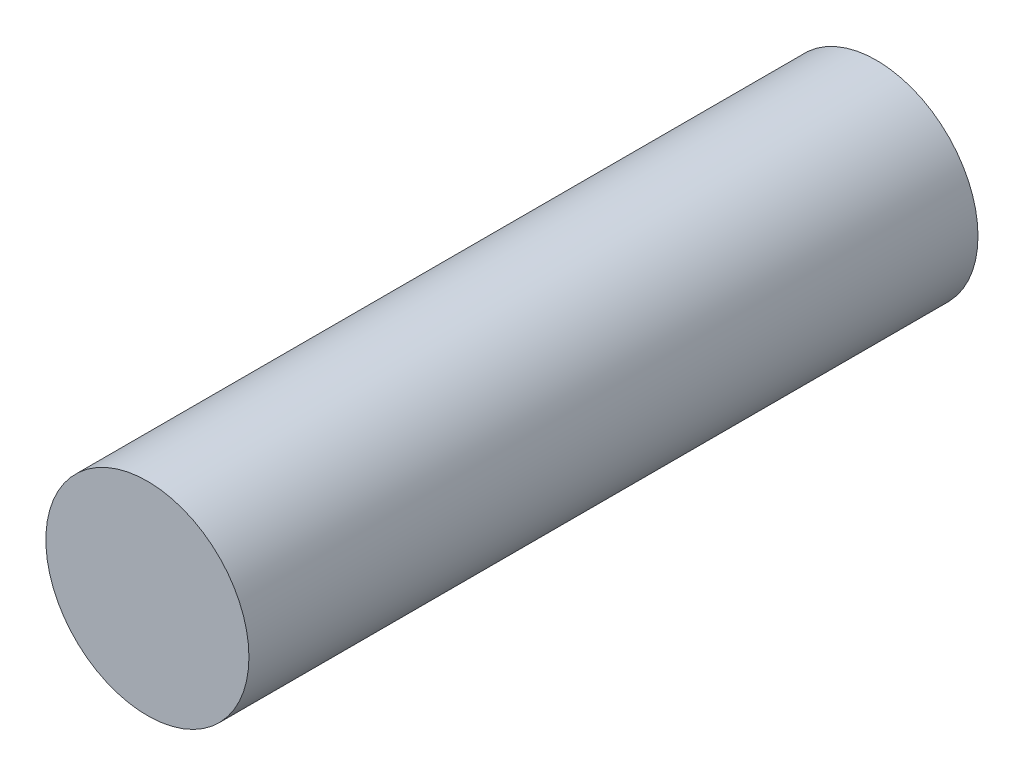
ISO-10303-21;
HEADER;
FILE_DESCRIPTION(('STEP AP214'),'2;1');
FILE_NAME('part.step','',(''),(''),'','','');
FILE_SCHEMA(('AUTOMOTIVE_DESIGN { 1 0 10303 214 1 1 1 1 }'));
ENDSEC;
DATA;
#1=APPLICATION_CONTEXT('core data for automotive mechanical design processes');
#2=APPLICATION_PROTOCOL_DEFINITION('international standard','automotive_design',2000,#1);
#3=PRODUCT_CONTEXT('',#1,'mechanical');
#4=PRODUCT('Part','Part','',(#3));
#5=PRODUCT_RELATED_PRODUCT_CATEGORY('part','',(#4));
#6=PRODUCT_DEFINITION_FORMATION('','',#4);
#7=PRODUCT_DEFINITION_CONTEXT('part definition',#1,'design');
#8=PRODUCT_DEFINITION('design','',#6,#7);
#9=PRODUCT_DEFINITION_SHAPE('','',#8);
#10=(LENGTH_UNIT() NAMED_UNIT(*) SI_UNIT(.MILLI.,.METRE.));
#11=(NAMED_UNIT(*) PLANE_ANGLE_UNIT() SI_UNIT($,.RADIAN.));
#12=(NAMED_UNIT(*) SI_UNIT($,.STERADIAN.) SOLID_ANGLE_UNIT());
#13=UNCERTAINTY_MEASURE_WITH_UNIT(LENGTH_MEASURE(1.E-05),#10,'distance_accuracy_value','');
#14=(GEOMETRIC_REPRESENTATION_CONTEXT(3) GLOBAL_UNCERTAINTY_ASSIGNED_CONTEXT((#13)) GLOBAL_UNIT_ASSIGNED_CONTEXT((#10,
#11,#12)) REPRESENTATION_CONTEXT('',''));
#15=CARTESIAN_POINT('',(0.,0.,0.));
#16=DIRECTION('',(0.,0.,1.));
#17=DIRECTION('',(1.,0.,0.));
#18=AXIS2_PLACEMENT_3D('',#15,#16,#17);
#19=CARTESIAN_POINT('',(0.,0.,-7.));
#20=DIRECTION('',(0.,0.,1.));
#21=DIRECTION('',(1.,0.,0.));
#22=AXIS2_PLACEMENT_3D('',#19,#20,#21);
#23=CYLINDRICAL_SURFACE('',#22,0.975);
#24=CARTESIAN_POINT('',(0.,0.,-7.));
#25=DIRECTION('',(0.,0.,1.));
#26=DIRECTION('',(1.,0.,0.));
#27=AXIS2_PLACEMENT_3D('',#24,#25,#26);
#28=CIRCLE('',#27,0.975);
#29=CARTESIAN_POINT('',(0.975,0.,-7.));
#30=VERTEX_POINT('',#29);
#31=EDGE_CURVE('E10',#30,#30,#28,.T.);
#32=ORIENTED_EDGE('',*,*,#31,.T.);
#33=EDGE_LOOP('',(#32));
#34=FACE_BOUND('',#33,.T.);
#35=CARTESIAN_POINT('',(0.,0.,0.));
#36=DIRECTION('',(0.,0.,1.));
#37=DIRECTION('',(1.,0.,0.));
#38=AXIS2_PLACEMENT_3D('',#35,#36,#37);
#39=CIRCLE('',#38,0.975);
#40=CARTESIAN_POINT('',(0.975,0.,0.));
#41=VERTEX_POINT('',#40);
#42=EDGE_CURVE('E44',#41,#41,#39,.T.);
#43=ORIENTED_EDGE('',*,*,#42,.F.);
#44=EDGE_LOOP('',(#43));
#45=FACE_BOUND('',#44,.T.);
#46=ADVANCED_FACE('F41',(#34,#45),#23,.T.);
#47=CARTESIAN_POINT('',(0.,0.,-7.));
#48=DIRECTION('',(0.,0.,1.));
#49=DIRECTION('',(1.,0.,0.));
#50=AXIS2_PLACEMENT_3D('',#47,#48,#49);
#51=PLANE('',#50);
#52=ORIENTED_EDGE('',*,*,#31,.F.);
#53=EDGE_LOOP('',(#52));
#54=FACE_BOUND('',#53,.T.);
#55=ADVANCED_FACE('F58',(#54),#51,.F.);
#56=CARTESIAN_POINT('',(0.,0.,0.));
#57=DIRECTION('',(0.,0.,1.));
#58=DIRECTION('',(1.,0.,0.));
#59=AXIS2_PLACEMENT_3D('',#56,#57,#58);
#60=PLANE('',#59);
#61=ORIENTED_EDGE('',*,*,#42,.T.);
#62=EDGE_LOOP('',(#61));
#63=FACE_BOUND('',#62,.T.);
#64=ADVANCED_FACE('F55',(#63),#60,.T.);
#65=CLOSED_SHELL('',(#46,#55,#64));
#66=MANIFOLD_SOLID_BREP('B2',#65);
#67=ADVANCED_BREP_SHAPE_REPRESENTATION('',(#18,#66),#14);
#68=SHAPE_DEFINITION_REPRESENTATION(#9,#67);
ENDSEC;
END-ISO-10303-21;
